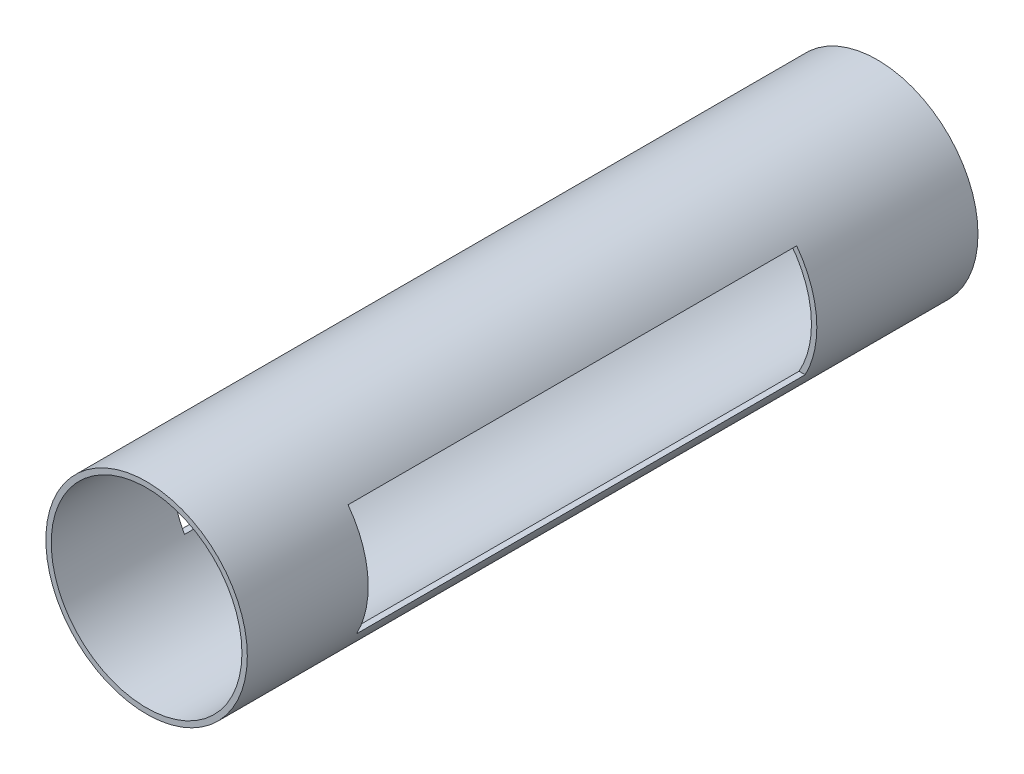
ISO-10303-21;
HEADER;
FILE_DESCRIPTION(('STEP AP214'),'2;1');
FILE_NAME('part.step','',(''),(''),'','','');
FILE_SCHEMA(('AUTOMOTIVE_DESIGN { 1 0 10303 214 1 1 1 1 }'));
ENDSEC;
DATA;
#1=APPLICATION_CONTEXT('core data for automotive mechanical design processes');
#2=APPLICATION_PROTOCOL_DEFINITION('international standard','automotive_design',2000,#1);
#3=PRODUCT_CONTEXT('',#1,'mechanical');
#4=PRODUCT('Part','Part','',(#3));
#5=PRODUCT_RELATED_PRODUCT_CATEGORY('part','',(#4));
#6=PRODUCT_DEFINITION_FORMATION('','',#4);
#7=PRODUCT_DEFINITION_CONTEXT('part definition',#1,'design');
#8=PRODUCT_DEFINITION('design','',#6,#7);
#9=PRODUCT_DEFINITION_SHAPE('','',#8);
#10=(LENGTH_UNIT() NAMED_UNIT(*) SI_UNIT(.MILLI.,.METRE.));
#11=(NAMED_UNIT(*) PLANE_ANGLE_UNIT() SI_UNIT($,.RADIAN.));
#12=(NAMED_UNIT(*) SI_UNIT($,.STERADIAN.) SOLID_ANGLE_UNIT());
#13=UNCERTAINTY_MEASURE_WITH_UNIT(LENGTH_MEASURE(1.E-05),#10,'distance_accuracy_value','');
#14=(GEOMETRIC_REPRESENTATION_CONTEXT(3) GLOBAL_UNCERTAINTY_ASSIGNED_CONTEXT((#13)) GLOBAL_UNIT_ASSIGNED_CONTEXT((#10,
#11,#12)) REPRESENTATION_CONTEXT('',''));
#15=CARTESIAN_POINT('',(0.,0.,0.));
#16=DIRECTION('',(0.,0.,1.));
#17=DIRECTION('',(1.,0.,0.));
#18=AXIS2_PLACEMENT_3D('',#15,#16,#17);
#19=CARTESIAN_POINT('',(0.,0.,272.));
#20=DIRECTION('',(0.,0.,1.));
#21=DIRECTION('',(1.,0.,0.));
#22=AXIS2_PLACEMENT_3D('',#19,#20,#21);
#23=PLANE('',#22);
#24=CARTESIAN_POINT('',(0.,0.,272.));
#25=DIRECTION('',(0.,0.,1.));
#26=DIRECTION('',(1.,0.,0.));
#27=AXIS2_PLACEMENT_3D('',#24,#25,#26);
#28=CIRCLE('',#27,37.5);
#29=CARTESIAN_POINT('',(37.5,0.,272.));
#30=VERTEX_POINT('',#29);
#31=EDGE_CURVE('E137',#30,#30,#28,.T.);
#32=ORIENTED_EDGE('',*,*,#31,.T.);
#33=EDGE_LOOP('',(#32));
#34=FACE_BOUND('',#33,.T.);
#35=CARTESIAN_POINT('',(0.,0.,272.));
#36=DIRECTION('',(0.,0.,1.));
#37=DIRECTION('',(1.,0.,0.));
#38=AXIS2_PLACEMENT_3D('',#35,#36,#37);
#39=CIRCLE('',#38,35.5);
#40=CARTESIAN_POINT('',(35.5,0.,272.));
#41=VERTEX_POINT('',#40);
#42=EDGE_CURVE('E143',#41,#41,#39,.T.);
#43=ORIENTED_EDGE('',*,*,#42,.F.);
#44=EDGE_LOOP('',(#43));
#45=FACE_BOUND('',#44,.T.);
#46=ADVANCED_FACE('F38',(#34,#45),#23,.T.);
#47=CARTESIAN_POINT('',(0.,0.,0.));
#48=DIRECTION('',(0.,0.,1.));
#49=DIRECTION('',(1.,0.,0.));
#50=AXIS2_PLACEMENT_3D('',#47,#48,#49);
#51=PLANE('',#50);
#52=CARTESIAN_POINT('',(0.,0.,0.));
#53=DIRECTION('',(0.,0.,1.));
#54=DIRECTION('',(1.,0.,0.));
#55=AXIS2_PLACEMENT_3D('',#52,#53,#54);
#56=CIRCLE('',#55,37.5);
#57=CARTESIAN_POINT('',(37.5,0.,0.));
#58=VERTEX_POINT('',#57);
#59=EDGE_CURVE('E139',#58,#58,#56,.T.);
#60=ORIENTED_EDGE('',*,*,#59,.F.);
#61=EDGE_LOOP('',(#60));
#62=FACE_BOUND('',#61,.T.);
#63=CARTESIAN_POINT('',(0.,0.,0.));
#64=DIRECTION('',(0.,0.,1.));
#65=DIRECTION('',(1.,0.,0.));
#66=AXIS2_PLACEMENT_3D('',#63,#64,#65);
#67=CIRCLE('',#66,35.5);
#68=CARTESIAN_POINT('',(35.5,0.,0.));
#69=VERTEX_POINT('',#68);
#70=EDGE_CURVE('E145',#69,#69,#67,.T.);
#71=ORIENTED_EDGE('',*,*,#70,.T.);
#72=EDGE_LOOP('',(#71));
#73=FACE_BOUND('',#72,.T.);
#74=ADVANCED_FACE('F196',(#62,#73),#51,.F.);
#75=CARTESIAN_POINT('',(0.,0.,272.));
#76=DIRECTION('',(0.,0.,-1.));
#77=DIRECTION('',(-1.,0.,0.));
#78=AXIS2_PLACEMENT_3D('',#75,#76,#77);
#79=CYLINDRICAL_SURFACE('',#78,37.5);
#80=DIRECTION('',(0.,0.,-1.));
#81=VECTOR('',#80,1.);
#82=CARTESIAN_POINT('',(-30.,22.5,272.));
#83=LINE('',#82,#81);
#84=CARTESIAN_POINT('',(-30.,22.5,60.));
#85=VERTEX_POINT('',#84);
#86=CARTESIAN_POINT('',(-30.,22.5,227.));
#87=VERTEX_POINT('',#86);
#88=EDGE_CURVE('E156',#85,#87,#83,.F.);
#89=ORIENTED_EDGE('',*,*,#88,.T.);
#90=CARTESIAN_POINT('',(0.,0.,227.));
#91=DIRECTION('',(0.,0.,1.));
#92=DIRECTION('',(1.,0.,0.));
#93=AXIS2_PLACEMENT_3D('',#90,#91,#92);
#94=CIRCLE('',#93,37.5);
#95=CARTESIAN_POINT('',(-33.166247903554,-17.5,227.));
#96=VERTEX_POINT('',#95);
#97=EDGE_CURVE('E148',#87,#96,#94,.T.);
#98=ORIENTED_EDGE('',*,*,#97,.T.);
#99=DIRECTION('',(0.,0.,-1.));
#100=VECTOR('',#99,1.);
#101=CARTESIAN_POINT('',(-33.166247903554,-17.5,272.));
#102=LINE('',#101,#100);
#103=CARTESIAN_POINT('',(-33.166247903554,-17.5,60.));
#104=VERTEX_POINT('',#103);
#105=EDGE_CURVE('E161',#96,#104,#102,.T.);
#106=ORIENTED_EDGE('',*,*,#105,.T.);
#107=CARTESIAN_POINT('',(0.,0.,60.));
#108=DIRECTION('',(0.,0.,-1.));
#109=DIRECTION('',(-1.,0.,0.));
#110=AXIS2_PLACEMENT_3D('',#107,#108,#109);
#111=CIRCLE('',#110,37.5);
#112=EDGE_CURVE('E117',#104,#85,#111,.T.);
#113=ORIENTED_EDGE('',*,*,#112,.T.);
#114=EDGE_LOOP('',(#89,#98,#106,#113));
#115=FACE_BOUND('',#114,.T.);
#116=CARTESIAN_POINT('',(33.166247903554,-17.5,227.));
#117=VERTEX_POINT('',#116);
#118=CARTESIAN_POINT('',(30.,22.5,227.));
#119=VERTEX_POINT('',#118);
#120=EDGE_CURVE('E151',#117,#119,#94,.T.);
#121=ORIENTED_EDGE('',*,*,#120,.T.);
#122=DIRECTION('',(0.,0.,-1.));
#123=VECTOR('',#122,1.);
#124=CARTESIAN_POINT('',(30.,22.5,272.));
#125=LINE('',#124,#123);
#126=CARTESIAN_POINT('',(30.,22.5,60.));
#127=VERTEX_POINT('',#126);
#128=EDGE_CURVE('E153',#119,#127,#125,.T.);
#129=ORIENTED_EDGE('',*,*,#128,.T.);
#130=CARTESIAN_POINT('',(33.166247903554,-17.5,60.));
#131=VERTEX_POINT('',#130);
#132=EDGE_CURVE('E159',#127,#131,#111,.T.);
#133=ORIENTED_EDGE('',*,*,#132,.T.);
#134=DIRECTION('',(0.,0.,-1.));
#135=VECTOR('',#134,1.);
#136=CARTESIAN_POINT('',(33.166247903554,-17.5,272.));
#137=LINE('',#136,#135);
#138=EDGE_CURVE('E163',#131,#117,#137,.F.);
#139=ORIENTED_EDGE('',*,*,#138,.T.);
#140=EDGE_LOOP('',(#121,#129,#133,#139));
#141=FACE_BOUND('',#140,.T.);
#142=ORIENTED_EDGE('',*,*,#31,.F.);
#143=EDGE_LOOP('',(#142));
#144=FACE_BOUND('',#143,.T.);
#145=ORIENTED_EDGE('',*,*,#59,.T.);
#146=EDGE_LOOP('',(#145));
#147=FACE_BOUND('',#146,.T.);
#148=ADVANCED_FACE('F40',(#115,#141,#144,#147),#79,.T.);
#149=CARTESIAN_POINT('',(0.,0.,272.));
#150=DIRECTION('',(0.,0.,-1.));
#151=DIRECTION('',(-1.,0.,0.));
#152=AXIS2_PLACEMENT_3D('',#149,#150,#151);
#153=CYLINDRICAL_SURFACE('',#152,35.5);
#154=CARTESIAN_POINT('',(0.,0.,227.));
#155=DIRECTION('',(0.,0.,1.));
#156=DIRECTION('',(1.,0.,0.));
#157=AXIS2_PLACEMENT_3D('',#154,#155,#156);
#158=CIRCLE('',#157,35.5);
#159=CARTESIAN_POINT('',(-27.459060435492,22.5,227.));
#160=VERTEX_POINT('',#159);
#161=CARTESIAN_POINT('',(-30.886890422961,-17.5,227.));
#162=VERTEX_POINT('',#161);
#163=EDGE_CURVE('E11',#160,#162,#158,.T.);
#164=ORIENTED_EDGE('',*,*,#163,.F.);
#165=DIRECTION('',(0.,0.,-1.));
#166=VECTOR('',#165,1.);
#167=CARTESIAN_POINT('',(-27.459060435492,22.5,272.));
#168=LINE('',#167,#166);
#169=CARTESIAN_POINT('',(-27.459060435492,22.5,60.));
#170=VERTEX_POINT('',#169);
#171=EDGE_CURVE('E42',#170,#160,#168,.F.);
#172=ORIENTED_EDGE('',*,*,#171,.F.);
#173=CARTESIAN_POINT('',(0.,0.,60.));
#174=DIRECTION('',(0.,0.,-1.));
#175=DIRECTION('',(-1.,0.,0.));
#176=AXIS2_PLACEMENT_3D('',#173,#174,#175);
#177=CIRCLE('',#176,35.5);
#178=CARTESIAN_POINT('',(-30.886890422961,-17.5,60.));
#179=VERTEX_POINT('',#178);
#180=EDGE_CURVE('E112',#179,#170,#177,.T.);
#181=ORIENTED_EDGE('',*,*,#180,.F.);
#182=DIRECTION('',(0.,0.,-1.));
#183=VECTOR('',#182,1.);
#184=CARTESIAN_POINT('',(-30.886890422961,-17.5,272.));
#185=LINE('',#184,#183);
#186=EDGE_CURVE('E105',#162,#179,#185,.T.);
#187=ORIENTED_EDGE('',*,*,#186,.F.);
#188=EDGE_LOOP('',(#164,#172,#181,#187));
#189=FACE_BOUND('',#188,.T.);
#190=CARTESIAN_POINT('',(30.886890422961,-17.5,227.));
#191=VERTEX_POINT('',#190);
#192=CARTESIAN_POINT('',(27.459060435492,22.5,227.));
#193=VERTEX_POINT('',#192);
#194=EDGE_CURVE('E48',#191,#193,#158,.T.);
#195=ORIENTED_EDGE('',*,*,#194,.F.);
#196=DIRECTION('',(0.,0.,-1.));
#197=VECTOR('',#196,1.);
#198=CARTESIAN_POINT('',(30.886890422961,-17.5,272.));
#199=LINE('',#198,#197);
#200=CARTESIAN_POINT('',(30.886890422961,-17.5,60.));
#201=VERTEX_POINT('',#200);
#202=EDGE_CURVE('E131',#201,#191,#199,.F.);
#203=ORIENTED_EDGE('',*,*,#202,.F.);
#204=CARTESIAN_POINT('',(27.459060435492,22.5,60.));
#205=VERTEX_POINT('',#204);
#206=EDGE_CURVE('E126',#205,#201,#177,.T.);
#207=ORIENTED_EDGE('',*,*,#206,.F.);
#208=DIRECTION('',(0.,0.,-1.));
#209=VECTOR('',#208,1.);
#210=CARTESIAN_POINT('',(27.459060435492,22.5,272.));
#211=LINE('',#210,#209);
#212=EDGE_CURVE('E130',#193,#205,#211,.T.);
#213=ORIENTED_EDGE('',*,*,#212,.F.);
#214=EDGE_LOOP('',(#195,#203,#207,#213));
#215=FACE_BOUND('',#214,.T.);
#216=ORIENTED_EDGE('',*,*,#42,.T.);
#217=EDGE_LOOP('',(#216));
#218=FACE_BOUND('',#217,.T.);
#219=ORIENTED_EDGE('',*,*,#70,.F.);
#220=EDGE_LOOP('',(#219));
#221=FACE_BOUND('',#220,.T.);
#222=ADVANCED_FACE('F123',(#189,#215,#218,#221),#153,.F.);
#223=CARTESIAN_POINT('',(-37.5,-17.5,227.));
#224=DIRECTION('',(0.,-1.,0.));
#225=DIRECTION('',(0.,0.,-1.));
#226=AXIS2_PLACEMENT_3D('',#223,#224,#225);
#227=PLANE('',#226);
#228=DIRECTION('',(1.,0.,0.));
#229=VECTOR('',#228,1.);
#230=CARTESIAN_POINT('',(-37.5,-17.5,60.));
#231=LINE('',#230,#229);
#232=EDGE_CURVE('E120',#201,#131,#231,.T.);
#233=ORIENTED_EDGE('',*,*,#232,.F.);
#234=ORIENTED_EDGE('',*,*,#202,.T.);
#235=DIRECTION('',(1.,0.,0.));
#236=VECTOR('',#235,1.);
#237=CARTESIAN_POINT('',(-37.5,-17.5,227.));
#238=LINE('',#237,#236);
#239=EDGE_CURVE('E63',#191,#117,#238,.T.);
#240=ORIENTED_EDGE('',*,*,#239,.T.);
#241=ORIENTED_EDGE('',*,*,#138,.F.);
#242=EDGE_LOOP('',(#233,#234,#240,#241));
#243=FACE_BOUND('',#242,.T.);
#244=ADVANCED_FACE('F205',(#243),#227,.F.);
#245=CARTESIAN_POINT('',(-37.5,-17.5,60.));
#246=DIRECTION('',(0.,0.,-1.));
#247=DIRECTION('',(-1.,0.,0.));
#248=AXIS2_PLACEMENT_3D('',#245,#246,#247);
#249=PLANE('',#248);
#250=DIRECTION('',(1.,0.,0.));
#251=VECTOR('',#250,1.);
#252=CARTESIAN_POINT('',(-37.5,22.5,60.));
#253=LINE('',#252,#251);
#254=EDGE_CURVE('E119',#205,#127,#253,.T.);
#255=ORIENTED_EDGE('',*,*,#254,.F.);
#256=ORIENTED_EDGE('',*,*,#206,.T.);
#257=ORIENTED_EDGE('',*,*,#232,.T.);
#258=ORIENTED_EDGE('',*,*,#132,.F.);
#259=EDGE_LOOP('',(#255,#256,#257,#258));
#260=FACE_BOUND('',#259,.T.);
#261=ADVANCED_FACE('F210',(#260),#249,.F.);
#262=CARTESIAN_POINT('',(-37.5,22.5,227.));
#263=DIRECTION('',(0.,1.,0.));
#264=DIRECTION('',(0.,0.,1.));
#265=AXIS2_PLACEMENT_3D('',#262,#263,#264);
#266=PLANE('',#265);
#267=DIRECTION('',(1.,0.,0.));
#268=VECTOR('',#267,1.);
#269=CARTESIAN_POINT('',(-37.5,22.5,227.));
#270=LINE('',#269,#268);
#271=EDGE_CURVE('E171',#193,#119,#270,.T.);
#272=ORIENTED_EDGE('',*,*,#271,.F.);
#273=ORIENTED_EDGE('',*,*,#212,.T.);
#274=ORIENTED_EDGE('',*,*,#254,.T.);
#275=ORIENTED_EDGE('',*,*,#128,.F.);
#276=EDGE_LOOP('',(#272,#273,#274,#275));
#277=FACE_BOUND('',#276,.T.);
#278=ADVANCED_FACE('F192',(#277),#266,.F.);
#279=CARTESIAN_POINT('',(-37.5,-17.5,227.));
#280=DIRECTION('',(0.,0.,1.));
#281=DIRECTION('',(1.,0.,0.));
#282=AXIS2_PLACEMENT_3D('',#279,#280,#281);
#283=PLANE('',#282);
#284=ORIENTED_EDGE('',*,*,#120,.F.);
#285=ORIENTED_EDGE('',*,*,#239,.F.);
#286=ORIENTED_EDGE('',*,*,#194,.T.);
#287=ORIENTED_EDGE('',*,*,#271,.T.);
#288=EDGE_LOOP('',(#284,#285,#286,#287));
#289=FACE_BOUND('',#288,.T.);
#290=ADVANCED_FACE('F185',(#289),#283,.F.);
#291=EDGE_CURVE('E166',#87,#160,#270,.T.);
#292=ORIENTED_EDGE('',*,*,#291,.T.);
#293=ORIENTED_EDGE('',*,*,#163,.T.);
#294=EDGE_CURVE('E108',#96,#162,#238,.T.);
#295=ORIENTED_EDGE('',*,*,#294,.F.);
#296=ORIENTED_EDGE('',*,*,#97,.F.);
#297=EDGE_LOOP('',(#292,#293,#295,#296));
#298=FACE_BOUND('',#297,.T.);
#299=ADVANCED_FACE('F183',(#298),#283,.F.);
#300=EDGE_CURVE('E170',#85,#170,#253,.T.);
#301=ORIENTED_EDGE('',*,*,#300,.T.);
#302=ORIENTED_EDGE('',*,*,#171,.T.);
#303=ORIENTED_EDGE('',*,*,#291,.F.);
#304=ORIENTED_EDGE('',*,*,#88,.F.);
#305=EDGE_LOOP('',(#301,#302,#303,#304));
#306=FACE_BOUND('',#305,.T.);
#307=ADVANCED_FACE('F178',(#306),#266,.F.);
#308=ORIENTED_EDGE('',*,*,#112,.F.);
#309=EDGE_CURVE('E55',#104,#179,#231,.T.);
#310=ORIENTED_EDGE('',*,*,#309,.T.);
#311=ORIENTED_EDGE('',*,*,#180,.T.);
#312=ORIENTED_EDGE('',*,*,#300,.F.);
#313=EDGE_LOOP('',(#308,#310,#311,#312));
#314=FACE_BOUND('',#313,.T.);
#315=ADVANCED_FACE('F114',(#314),#249,.F.);
#316=ORIENTED_EDGE('',*,*,#294,.T.);
#317=ORIENTED_EDGE('',*,*,#186,.T.);
#318=ORIENTED_EDGE('',*,*,#309,.F.);
#319=ORIENTED_EDGE('',*,*,#105,.F.);
#320=EDGE_LOOP('',(#316,#317,#318,#319));
#321=FACE_BOUND('',#320,.T.);
#322=ADVANCED_FACE('F106',(#321),#227,.F.);
#323=CLOSED_SHELL('',(#46,#74,#148,#222,#244,#261,#278,#290,#299,#307,#315,#322));
#324=MANIFOLD_SOLID_BREP('B2',#323);
#325=ADVANCED_BREP_SHAPE_REPRESENTATION('',(#18,#324),#14);
#326=SHAPE_DEFINITION_REPRESENTATION(#9,#325);
ENDSEC;
END-ISO-10303-21;
